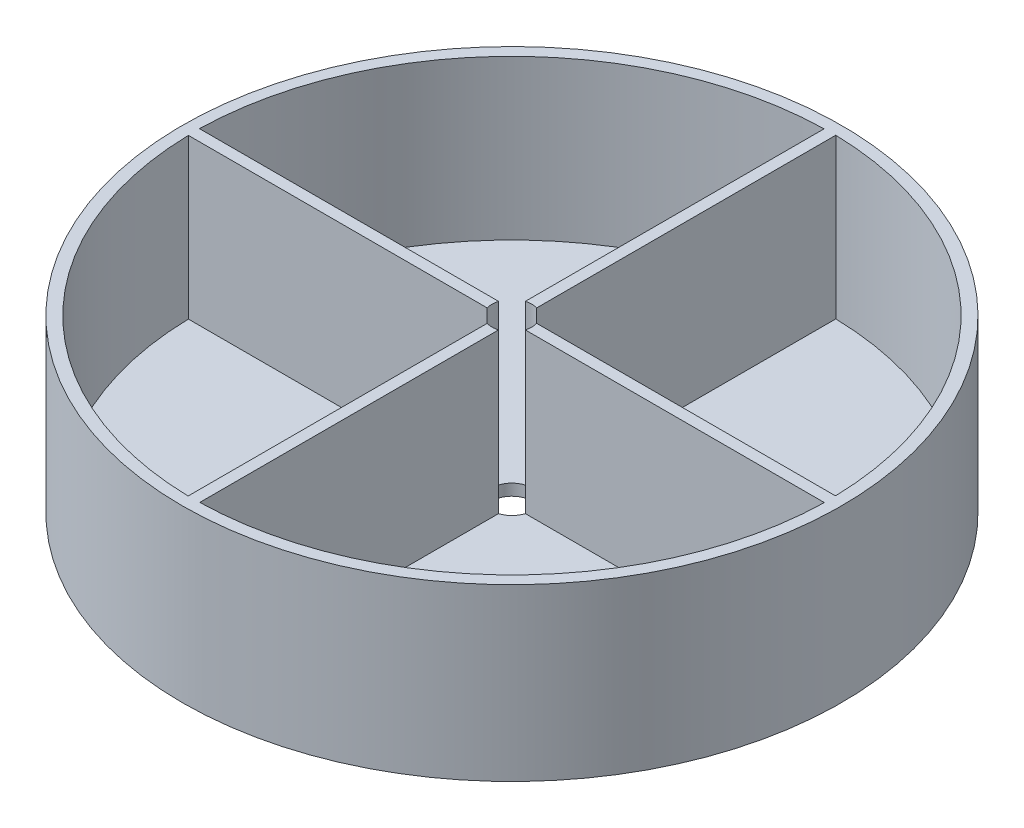
ISO-10303-21;
HEADER;
FILE_DESCRIPTION(('STEP AP214'),'2;1');
FILE_NAME('part.step','',(''),(''),'','','');
FILE_SCHEMA(('AUTOMOTIVE_DESIGN { 1 0 10303 214 1 1 1 1 }'));
ENDSEC;
DATA;
#1=APPLICATION_CONTEXT('core data for automotive mechanical design processes');
#2=APPLICATION_PROTOCOL_DEFINITION('international standard','automotive_design',2000,#1);
#3=PRODUCT_CONTEXT('',#1,'mechanical');
#4=PRODUCT('Part','Part','',(#3));
#5=PRODUCT_RELATED_PRODUCT_CATEGORY('part','',(#4));
#6=PRODUCT_DEFINITION_FORMATION('','',#4);
#7=PRODUCT_DEFINITION_CONTEXT('part definition',#1,'design');
#8=PRODUCT_DEFINITION('design','',#6,#7);
#9=PRODUCT_DEFINITION_SHAPE('','',#8);
#10=(LENGTH_UNIT() NAMED_UNIT(*) SI_UNIT(.MILLI.,.METRE.));
#11=(NAMED_UNIT(*) PLANE_ANGLE_UNIT() SI_UNIT($,.RADIAN.));
#12=(NAMED_UNIT(*) SI_UNIT($,.STERADIAN.) SOLID_ANGLE_UNIT());
#13=UNCERTAINTY_MEASURE_WITH_UNIT(LENGTH_MEASURE(1.E-05),#10,'distance_accuracy_value','');
#14=(GEOMETRIC_REPRESENTATION_CONTEXT(3) GLOBAL_UNCERTAINTY_ASSIGNED_CONTEXT((#13)) GLOBAL_UNIT_ASSIGNED_CONTEXT((#10,
#11,#12)) REPRESENTATION_CONTEXT('',''));
#15=CARTESIAN_POINT('',(0.,0.,0.));
#16=DIRECTION('',(0.,0.,1.));
#17=DIRECTION('',(1.,0.,0.));
#18=AXIS2_PLACEMENT_3D('',#15,#16,#17);
#19=CARTESIAN_POINT('',(0.177726025371028,2.,0.229348354891183));
#20=DIRECTION('',(0.,-1.,0.));
#21=DIRECTION('',(0.,0.,-1.));
#22=AXIS2_PLACEMENT_3D('',#19,#20,#21);
#23=PLANE('',#22);
#24=DIRECTION('',(0.,0.,1.));
#25=VECTOR('',#24,1.);
#26=CARTESIAN_POINT('',(0.999998069287808,2.,-55.9913883981413));
#27=LINE('',#26,#25);
#28=CARTESIAN_POINT('',(0.999998069287808,2.,-55.9913883981413));
#29=VERTEX_POINT('',#28);
#30=CARTESIAN_POINT('',(0.999998069287808,2.,-3.35410254187624));
#31=VERTEX_POINT('',#30);
#32=EDGE_CURVE('E224',#29,#31,#27,.T.);
#33=ORIENTED_EDGE('',*,*,#32,.T.);
#34=CARTESIAN_POINT('',(0.,2.,0.));
#35=DIRECTION('',(0.,1.,0.));
#36=DIRECTION('',(0.,0.,1.));
#37=AXIS2_PLACEMENT_3D('',#34,#35,#36);
#38=CIRCLE('',#37,3.5);
#39=CARTESIAN_POINT('',(3.35409906574127,2.,-1.00000972854944));
#40=VERTEX_POINT('',#39);
#41=EDGE_CURVE('E165',#40,#31,#38,.T.);
#42=ORIENTED_EDGE('',*,*,#41,.F.);
#43=DIRECTION('',(1.,0.,0.));
#44=VECTOR('',#43,1.);
#45=CARTESIAN_POINT('',(0.999998069287808,2.,-1.00000972854944));
#46=LINE('',#45,#44);
#47=CARTESIAN_POINT('',(55.9408605117633,2.,-1.00000972854944));
#48=VERTEX_POINT('',#47);
#49=EDGE_CURVE('E221',#40,#48,#46,.T.);
#50=ORIENTED_EDGE('',*,*,#49,.T.);
#51=CARTESIAN_POINT('',(-0.2293502856028,2.,0.177716296821585));
#52=DIRECTION('',(0.,-1.,0.));
#53=DIRECTION('',(0.,0.,-1.));
#54=AXIS2_PLACEMENT_3D('',#51,#52,#53);
#55=CIRCLE('',#54,56.1825561861631);
#56=EDGE_CURVE('E218',#29,#48,#55,.T.);
#57=ORIENTED_EDGE('',*,*,#56,.F.);
#58=EDGE_LOOP('',(#33,#42,#50,#57));
#59=FACE_BOUND('',#58,.T.);
#60=ADVANCED_FACE('F39',(#59),#23,.F.);
#61=DIRECTION('',(-0.99999999999999,0.,1.44511747345322E-07));
#62=VECTOR('',#61,1.);
#63=CARTESIAN_POINT('',(55.9913615258952,2.,0.9999921655222));
#64=LINE('',#63,#62);
#65=CARTESIAN_POINT('',(55.9913615258952,2.,0.9999921655222));
#66=VERTEX_POINT('',#65);
#67=CARTESIAN_POINT('',(3.3541020341592,2.,0.999999772224545));
#68=VERTEX_POINT('',#67);
#69=EDGE_CURVE('E161',#66,#68,#64,.T.);
#70=ORIENTED_EDGE('',*,*,#69,.T.);
#71=CARTESIAN_POINT('',(0.999997417442707,2.,3.35410273621842));
#72=VERTEX_POINT('',#71);
#73=EDGE_CURVE('E153',#72,#68,#38,.T.);
#74=ORIENTED_EDGE('',*,*,#73,.F.);
#75=DIRECTION('',(-2.76897487340924E-07,0.,0.999999999999962));
#76=VECTOR('',#75,1.);
#77=CARTESIAN_POINT('',(0.999998069287809,2.,1.00000011242022));
#78=LINE('',#77,#76);
#79=CARTESIAN_POINT('',(0.999982856303247,2.,55.9408546079976));
#80=VERTEX_POINT('',#79);
#81=EDGE_CURVE('E158',#72,#80,#78,.T.);
#82=ORIENTED_EDGE('',*,*,#81,.T.);
#83=CARTESIAN_POINT('',(-0.177743169067848,2.,-0.229356189368632));
#84=DIRECTION('',(0.,-1.,0.));
#85=DIRECTION('',(0.,0.,-1.));
#86=AXIS2_PLACEMENT_3D('',#83,#84,#85);
#87=CIRCLE('',#86,56.1825561861632);
#88=EDGE_CURVE('E183',#66,#80,#87,.T.);
#89=ORIENTED_EDGE('',*,*,#88,.F.);
#90=EDGE_LOOP('',(#70,#74,#82,#89));
#91=FACE_BOUND('',#90,.T.);
#92=ADVANCED_FACE('F155',(#91),#23,.F.);
#93=DIRECTION('',(0.,0.,-1.));
#94=VECTOR('',#93,1.);
#95=CARTESIAN_POINT('',(-1.00000080491135,2.,55.9913787820121));
#96=LINE('',#95,#94);
#97=CARTESIAN_POINT('',(-1.00000080491135,2.,55.9913787820121));
#98=VERTEX_POINT('',#97);
#99=CARTESIAN_POINT('',(-1.00000080491135,2.,3.35410172627138));
#100=VERTEX_POINT('',#99);
#101=EDGE_CURVE('E205',#98,#100,#96,.T.);
#102=ORIENTED_EDGE('',*,*,#101,.T.);
#103=CARTESIAN_POINT('',(-3.35410193273245,2.,1.00000011242022));
#104=VERTEX_POINT('',#103);
#105=EDGE_CURVE('E167',#104,#100,#38,.T.);
#106=ORIENTED_EDGE('',*,*,#105,.F.);
#107=DIRECTION('',(-1.,0.,0.));
#108=VECTOR('',#107,1.);
#109=CARTESIAN_POINT('',(-1.00000080491135,2.,1.00000011242022));
#110=LINE('',#109,#108);
#111=CARTESIAN_POINT('',(-55.9408632473865,2.,1.00000011242022));
#112=VERTEX_POINT('',#111);
#113=EDGE_CURVE('E202',#104,#112,#110,.T.);
#114=ORIENTED_EDGE('',*,*,#113,.T.);
#115=CARTESIAN_POINT('',(0.229347549979632,2.,-0.177725912950824));
#116=DIRECTION('',(0.,-1.,0.));
#117=DIRECTION('',(0.,0.,-1.));
#118=AXIS2_PLACEMENT_3D('',#115,#116,#117);
#119=CIRCLE('',#118,56.1825561861632);
#120=EDGE_CURVE('E199',#98,#112,#119,.T.);
#121=ORIENTED_EDGE('',*,*,#120,.F.);
#122=EDGE_LOOP('',(#102,#106,#114,#121));
#123=FACE_BOUND('',#122,.T.);
#124=ADVANCED_FACE('F286',(#123),#23,.F.);
#125=CARTESIAN_POINT('',(-1.00000000000001,2.,-0.999999999999995));
#126=DIRECTION('',(1.,0.,0.));
#127=DIRECTION('',(0.,0.,-1.));
#128=AXIS2_PLACEMENT_3D('',#125,#126,#127);
#129=PLANE('',#128);
#130=DIRECTION('',(0.,-1.,0.));
#131=VECTOR('',#130,1.);
#132=CARTESIAN_POINT('',(-1.00000000000001,30.,-3.35410196624968));
#133=LINE('',#132,#131);
#134=CARTESIAN_POINT('',(-1.00000000000001,30.,-3.35410196624968));
#135=VERTEX_POINT('',#134);
#136=CARTESIAN_POINT('',(-1.00000000000001,2.,-3.35410196624968));
#137=VERTEX_POINT('',#136);
#138=EDGE_CURVE('E193',#135,#137,#133,.T.);
#139=ORIENTED_EDGE('',*,*,#138,.F.);
#140=DIRECTION('',(0.,0.,-1.));
#141=VECTOR('',#140,1.);
#142=CARTESIAN_POINT('',(-1.00000000000001,30.,-0.999999999999995));
#143=LINE('',#142,#141);
#144=CARTESIAN_POINT('',(-1.,30.,-55.9408624424749));
#145=VERTEX_POINT('',#144);
#146=EDGE_CURVE('E252',#135,#145,#143,.T.);
#147=ORIENTED_EDGE('',*,*,#146,.T.);
#148=DIRECTION('',(0.,1.,0.));
#149=VECTOR('',#148,1.);
#150=CARTESIAN_POINT('',(-1.,2.,-55.9408624424749));
#151=LINE('',#150,#149);
#152=CARTESIAN_POINT('',(-1.,2.,-55.9408624424749));
#153=VERTEX_POINT('',#152);
#154=EDGE_CURVE('E258',#153,#145,#151,.T.);
#155=ORIENTED_EDGE('',*,*,#154,.F.);
#156=DIRECTION('',(0.,0.,-1.));
#157=VECTOR('',#156,1.);
#158=CARTESIAN_POINT('',(-1.00000000000001,2.,-0.999999999999995));
#159=LINE('',#158,#157);
#160=EDGE_CURVE('E243',#137,#153,#159,.T.);
#161=ORIENTED_EDGE('',*,*,#160,.F.);
#162=EDGE_LOOP('',(#139,#147,#155,#161));
#163=FACE_BOUND('',#162,.T.);
#164=ADVANCED_FACE('F298',(#163),#129,.F.);
#165=CARTESIAN_POINT('',(-55.9913786695919,2.,-1.));
#166=DIRECTION('',(0.,0.,1.));
#167=DIRECTION('',(1.,0.,0.));
#168=AXIS2_PLACEMENT_3D('',#165,#166,#167);
#169=PLANE('',#168);
#170=DIRECTION('',(0.,-1.,0.));
#171=VECTOR('',#170,1.);
#172=CARTESIAN_POINT('',(-3.35410196624969,30.,-0.999999999999995));
#173=LINE('',#172,#171);
#174=CARTESIAN_POINT('',(-3.35410196624969,2.,-0.999999999999995));
#175=VERTEX_POINT('',#174);
#176=CARTESIAN_POINT('',(-3.35410196624969,30.,-0.999999999999995));
#177=VERTEX_POINT('',#176);
#178=EDGE_CURVE('E323',#175,#177,#173,.F.);
#179=ORIENTED_EDGE('',*,*,#178,.F.);
#180=DIRECTION('',(1.,0.,0.));
#181=VECTOR('',#180,1.);
#182=CARTESIAN_POINT('',(-55.9913786695919,2.,-1.));
#183=LINE('',#182,#181);
#184=CARTESIAN_POINT('',(-55.9913786695919,2.,-1.));
#185=VERTEX_POINT('',#184);
#186=EDGE_CURVE('E246',#185,#175,#183,.T.);
#187=ORIENTED_EDGE('',*,*,#186,.F.);
#188=DIRECTION('',(0.,1.,0.));
#189=VECTOR('',#188,1.);
#190=CARTESIAN_POINT('',(-55.9913786695919,2.,-1.));
#191=LINE('',#190,#189);
#192=CARTESIAN_POINT('',(-55.9913786695919,30.,-1.));
#193=VERTEX_POINT('',#192);
#194=EDGE_CURVE('E249',#185,#193,#191,.T.);
#195=ORIENTED_EDGE('',*,*,#194,.T.);
#196=DIRECTION('',(1.,0.,0.));
#197=VECTOR('',#196,1.);
#198=CARTESIAN_POINT('',(-55.9913786695919,30.,-1.));
#199=LINE('',#198,#197);
#200=EDGE_CURVE('E244',#193,#177,#199,.T.);
#201=ORIENTED_EDGE('',*,*,#200,.T.);
#202=EDGE_LOOP('',(#179,#187,#195,#201));
#203=FACE_BOUND('',#202,.T.);
#204=ADVANCED_FACE('F303',(#203),#169,.F.);
#205=CARTESIAN_POINT('',(0.999998069287808,2.,-1.00000972854944));
#206=DIRECTION('',(0.,0.,1.));
#207=DIRECTION('',(1.,0.,0.));
#208=AXIS2_PLACEMENT_3D('',#205,#206,#207);
#209=PLANE('',#208);
#210=DIRECTION('',(0.,-1.,0.));
#211=VECTOR('',#210,1.);
#212=CARTESIAN_POINT('',(3.35409906574127,30.,-1.00000972854944));
#213=LINE('',#212,#211);
#214=CARTESIAN_POINT('',(3.35409906574127,30.,-1.00000972854944));
#215=VERTEX_POINT('',#214);
#216=EDGE_CURVE('E320',#215,#40,#213,.T.);
#217=ORIENTED_EDGE('',*,*,#216,.F.);
#218=DIRECTION('',(1.,0.,0.));
#219=VECTOR('',#218,1.);
#220=CARTESIAN_POINT('',(0.999998069287808,30.,-1.00000972854944));
#221=LINE('',#220,#219);
#222=CARTESIAN_POINT('',(55.9408605117633,30.,-1.00000972854944));
#223=VERTEX_POINT('',#222);
#224=EDGE_CURVE('E230',#215,#223,#221,.T.);
#225=ORIENTED_EDGE('',*,*,#224,.T.);
#226=DIRECTION('',(0.,1.,0.));
#227=VECTOR('',#226,1.);
#228=CARTESIAN_POINT('',(55.9408605117633,2.,-1.00000972854944));
#229=LINE('',#228,#227);
#230=EDGE_CURVE('E236',#48,#223,#229,.T.);
#231=ORIENTED_EDGE('',*,*,#230,.F.);
#232=ORIENTED_EDGE('',*,*,#49,.F.);
#233=EDGE_LOOP('',(#217,#225,#231,#232));
#234=FACE_BOUND('',#233,.T.);
#235=ADVANCED_FACE('F350',(#234),#209,.F.);
#236=CARTESIAN_POINT('',(0.999998069287808,2.,-55.9913883981413));
#237=DIRECTION('',(-1.,0.,0.));
#238=DIRECTION('',(0.,0.,1.));
#239=AXIS2_PLACEMENT_3D('',#236,#237,#238);
#240=PLANE('',#239);
#241=DIRECTION('',(0.,-1.,0.));
#242=VECTOR('',#241,1.);
#243=CARTESIAN_POINT('',(0.999998069287808,30.,-3.35410254187624));
#244=LINE('',#243,#242);
#245=CARTESIAN_POINT('',(0.999998069287808,30.,-3.35410254187624));
#246=VERTEX_POINT('',#245);
#247=EDGE_CURVE('E315',#31,#246,#244,.F.);
#248=ORIENTED_EDGE('',*,*,#247,.F.);
#249=ORIENTED_EDGE('',*,*,#32,.F.);
#250=DIRECTION('',(0.,1.,0.));
#251=VECTOR('',#250,1.);
#252=CARTESIAN_POINT('',(0.999998069287808,2.,-55.9913883981413));
#253=LINE('',#252,#251);
#254=CARTESIAN_POINT('',(0.999998069287808,30.,-55.9913883981413));
#255=VERTEX_POINT('',#254);
#256=EDGE_CURVE('E227',#29,#255,#253,.T.);
#257=ORIENTED_EDGE('',*,*,#256,.T.);
#258=DIRECTION('',(0.,0.,1.));
#259=VECTOR('',#258,1.);
#260=CARTESIAN_POINT('',(0.999998069287808,30.,-55.9913883981413));
#261=LINE('',#260,#259);
#262=EDGE_CURVE('E222',#255,#246,#261,.T.);
#263=ORIENTED_EDGE('',*,*,#262,.T.);
#264=EDGE_LOOP('',(#248,#249,#257,#263));
#265=FACE_BOUND('',#264,.T.);
#266=ADVANCED_FACE('F357',(#265),#240,.F.);
#267=CARTESIAN_POINT('',(-1.00000080491135,2.,1.00000011242022));
#268=DIRECTION('',(0.,0.,-1.));
#269=DIRECTION('',(-1.,0.,0.));
#270=AXIS2_PLACEMENT_3D('',#267,#268,#269);
#271=PLANE('',#270);
#272=DIRECTION('',(0.,-1.,0.));
#273=VECTOR('',#272,1.);
#274=CARTESIAN_POINT('',(-3.35410193273245,30.,1.00000011242022));
#275=LINE('',#274,#273);
#276=CARTESIAN_POINT('',(-3.35410193273245,30.,1.00000011242022));
#277=VERTEX_POINT('',#276);
#278=EDGE_CURVE('E313',#277,#104,#275,.T.);
#279=ORIENTED_EDGE('',*,*,#278,.F.);
#280=DIRECTION('',(-1.,0.,0.));
#281=VECTOR('',#280,1.);
#282=CARTESIAN_POINT('',(-1.00000080491135,30.,1.00000011242022));
#283=LINE('',#282,#281);
#284=CARTESIAN_POINT('',(-55.9408632473865,30.,1.00000011242022));
#285=VERTEX_POINT('',#284);
#286=EDGE_CURVE('E210',#277,#285,#283,.T.);
#287=ORIENTED_EDGE('',*,*,#286,.T.);
#288=DIRECTION('',(0.,1.,0.));
#289=VECTOR('',#288,1.);
#290=CARTESIAN_POINT('',(-55.9408632473865,2.,1.00000011242022));
#291=LINE('',#290,#289);
#292=EDGE_CURVE('E215',#112,#285,#291,.T.);
#293=ORIENTED_EDGE('',*,*,#292,.F.);
#294=ORIENTED_EDGE('',*,*,#113,.F.);
#295=EDGE_LOOP('',(#279,#287,#293,#294));
#296=FACE_BOUND('',#295,.T.);
#297=ADVANCED_FACE('F361',(#296),#271,.F.);
#298=CARTESIAN_POINT('',(-1.00000080491135,2.,55.9913787820121));
#299=DIRECTION('',(1.,0.,0.));
#300=DIRECTION('',(0.,0.,-1.));
#301=AXIS2_PLACEMENT_3D('',#298,#299,#300);
#302=PLANE('',#301);
#303=DIRECTION('',(0.,-1.,0.));
#304=VECTOR('',#303,1.);
#305=CARTESIAN_POINT('',(-1.00000080491135,30.,3.35410172627138));
#306=LINE('',#305,#304);
#307=CARTESIAN_POINT('',(-1.00000080491135,30.,3.35410172627138));
#308=VERTEX_POINT('',#307);
#309=EDGE_CURVE('E177',#100,#308,#306,.F.);
#310=ORIENTED_EDGE('',*,*,#309,.F.);
#311=ORIENTED_EDGE('',*,*,#101,.F.);
#312=DIRECTION('',(0.,1.,0.));
#313=VECTOR('',#312,1.);
#314=CARTESIAN_POINT('',(-1.00000080491135,2.,55.9913787820121));
#315=LINE('',#314,#313);
#316=CARTESIAN_POINT('',(-1.00000080491135,30.,55.9913787820121));
#317=VERTEX_POINT('',#316);
#318=EDGE_CURVE('E208',#98,#317,#315,.T.);
#319=ORIENTED_EDGE('',*,*,#318,.T.);
#320=DIRECTION('',(0.,0.,-1.));
#321=VECTOR('',#320,1.);
#322=CARTESIAN_POINT('',(-1.00000080491135,30.,55.9913787820121));
#323=LINE('',#322,#321);
#324=EDGE_CURVE('E203',#317,#308,#323,.T.);
#325=ORIENTED_EDGE('',*,*,#324,.T.);
#326=EDGE_LOOP('',(#310,#311,#319,#325));
#327=FACE_BOUND('',#326,.T.);
#328=ADVANCED_FACE('F311',(#327),#302,.F.);
#329=CARTESIAN_POINT('',(0.999998069287809,2.,1.00000011242022));
#330=DIRECTION('',(-0.999999999999962,0.,-2.76897487340924E-07));
#331=DIRECTION('',(-2.76897487340924E-07,0.,0.999999999999962));
#332=AXIS2_PLACEMENT_3D('',#329,#330,#331);
#333=PLANE('',#332);
#334=DIRECTION('',(0.,-1.,0.));
#335=VECTOR('',#334,1.);
#336=CARTESIAN_POINT('',(0.999997417442707,30.,3.35410273621842));
#337=LINE('',#336,#335);
#338=CARTESIAN_POINT('',(0.999997417442707,30.,3.35410273621842));
#339=VERTEX_POINT('',#338);
#340=EDGE_CURVE('E169',#339,#72,#337,.T.);
#341=ORIENTED_EDGE('',*,*,#340,.F.);
#342=DIRECTION('',(-2.76897487340924E-07,0.,0.999999999999962));
#343=VECTOR('',#342,1.);
#344=CARTESIAN_POINT('',(0.999998069287809,30.,1.00000011242022));
#345=LINE('',#344,#343);
#346=CARTESIAN_POINT('',(0.999982856303247,30.,55.9408546079976));
#347=VERTEX_POINT('',#346);
#348=EDGE_CURVE('E192',#339,#347,#345,.T.);
#349=ORIENTED_EDGE('',*,*,#348,.T.);
#350=DIRECTION('',(0.,1.,0.));
#351=VECTOR('',#350,1.);
#352=CARTESIAN_POINT('',(0.999982856303247,2.,55.9408546079976));
#353=LINE('',#352,#351);
#354=EDGE_CURVE('E182',#80,#347,#353,.T.);
#355=ORIENTED_EDGE('',*,*,#354,.F.);
#356=ORIENTED_EDGE('',*,*,#81,.F.);
#357=EDGE_LOOP('',(#341,#349,#355,#356));
#358=FACE_BOUND('',#357,.T.);
#359=ADVANCED_FACE('F181',(#358),#333,.F.);
#360=CARTESIAN_POINT('',(55.9913615258952,2.,0.9999921655222));
#361=DIRECTION('',(-1.44511747345322E-07,0.,-0.99999999999999));
#362=DIRECTION('',(-0.99999999999999,0.,1.44511747345322E-07));
#363=AXIS2_PLACEMENT_3D('',#360,#361,#362);
#364=PLANE('',#363);
#365=DIRECTION('',(0.,-1.,0.));
#366=VECTOR('',#365,1.);
#367=CARTESIAN_POINT('',(3.3541020341592,30.,0.999999772224545));
#368=LINE('',#367,#366);
#369=CARTESIAN_POINT('',(3.3541020341592,30.,0.999999772224545));
#370=VERTEX_POINT('',#369);
#371=EDGE_CURVE('E178',#68,#370,#368,.F.);
#372=ORIENTED_EDGE('',*,*,#371,.F.);
#373=ORIENTED_EDGE('',*,*,#69,.F.);
#374=DIRECTION('',(0.,1.,0.));
#375=VECTOR('',#374,1.);
#376=CARTESIAN_POINT('',(55.9913615258952,2.,0.9999921655222));
#377=LINE('',#376,#375);
#378=CARTESIAN_POINT('',(55.9913615258952,30.,0.9999921655222));
#379=VERTEX_POINT('',#378);
#380=EDGE_CURVE('E185',#66,#379,#377,.T.);
#381=ORIENTED_EDGE('',*,*,#380,.T.);
#382=DIRECTION('',(-0.99999999999999,0.,1.44511747345322E-07));
#383=VECTOR('',#382,1.);
#384=CARTESIAN_POINT('',(55.9913615258952,30.,0.9999921655222));
#385=LINE('',#384,#383);
#386=EDGE_CURVE('E187',#379,#370,#385,.T.);
#387=ORIENTED_EDGE('',*,*,#386,.T.);
#388=EDGE_LOOP('',(#372,#373,#381,#387));
#389=FACE_BOUND('',#388,.T.);
#390=ADVANCED_FACE('F364',(#389),#364,.F.);
#391=CARTESIAN_POINT('',(0.,30.,0.));
#392=DIRECTION('',(0.,1.,0.));
#393=DIRECTION('',(0.,0.,1.));
#394=AXIS2_PLACEMENT_3D('',#391,#392,#393);
#395=PLANE('',#394);
#396=ORIENTED_EDGE('',*,*,#286,.F.);
#397=CARTESIAN_POINT('',(0.,30.,0.));
#398=DIRECTION('',(0.,1.,0.));
#399=DIRECTION('',(0.,0.,1.));
#400=AXIS2_PLACEMENT_3D('',#397,#398,#399);
#401=CIRCLE('',#400,3.5);
#402=EDGE_CURVE('E339',#177,#277,#401,.T.);
#403=ORIENTED_EDGE('',*,*,#402,.F.);
#404=ORIENTED_EDGE('',*,*,#200,.F.);
#405=CARTESIAN_POINT('',(0.177726025371028,30.,0.229348354891183));
#406=DIRECTION('',(0.,-1.,0.));
#407=DIRECTION('',(0.,0.,-1.));
#408=AXIS2_PLACEMENT_3D('',#405,#406,#407);
#409=CIRCLE('',#408,56.1825561861632);
#410=EDGE_CURVE('E239',#193,#145,#409,.T.);
#411=ORIENTED_EDGE('',*,*,#410,.T.);
#412=ORIENTED_EDGE('',*,*,#146,.F.);
#413=EDGE_CURVE('E329',#246,#135,#401,.T.);
#414=ORIENTED_EDGE('',*,*,#413,.F.);
#415=ORIENTED_EDGE('',*,*,#262,.F.);
#416=CARTESIAN_POINT('',(-0.2293502856028,30.,0.177716296821585));
#417=DIRECTION('',(0.,-1.,0.));
#418=DIRECTION('',(0.,0.,-1.));
#419=AXIS2_PLACEMENT_3D('',#416,#417,#418);
#420=CIRCLE('',#419,56.1825561861631);
#421=EDGE_CURVE('E217',#255,#223,#420,.T.);
#422=ORIENTED_EDGE('',*,*,#421,.T.);
#423=ORIENTED_EDGE('',*,*,#224,.F.);
#424=EDGE_CURVE('E342',#370,#215,#401,.T.);
#425=ORIENTED_EDGE('',*,*,#424,.F.);
#426=ORIENTED_EDGE('',*,*,#386,.F.);
#427=CARTESIAN_POINT('',(-0.177743169067848,30.,-0.229356189368632));
#428=DIRECTION('',(0.,-1.,0.));
#429=DIRECTION('',(0.,0.,-1.));
#430=AXIS2_PLACEMENT_3D('',#427,#428,#429);
#431=CIRCLE('',#430,56.1825561861632);
#432=EDGE_CURVE('E54',#379,#347,#431,.T.);
#433=ORIENTED_EDGE('',*,*,#432,.T.);
#434=ORIENTED_EDGE('',*,*,#348,.F.);
#435=EDGE_CURVE('E174',#308,#339,#401,.T.);
#436=ORIENTED_EDGE('',*,*,#435,.F.);
#437=ORIENTED_EDGE('',*,*,#324,.F.);
#438=CARTESIAN_POINT('',(0.229347549979632,30.,-0.177725912950824));
#439=DIRECTION('',(0.,-1.,0.));
#440=DIRECTION('',(0.,0.,-1.));
#441=AXIS2_PLACEMENT_3D('',#438,#439,#440);
#442=CIRCLE('',#441,56.1825561861632);
#443=EDGE_CURVE('E62',#317,#285,#442,.T.);
#444=ORIENTED_EDGE('',*,*,#443,.T.);
#445=EDGE_LOOP('',(#396,#403,#404,#411,#412,#414,#415,#422,#423,#425,#426,#433,#434,#436,#437,#444));
#446=FACE_BOUND('',#445,.T.);
#447=CARTESIAN_POINT('',(0.,30.,0.));
#448=DIRECTION('',(0.,1.,0.));
#449=DIRECTION('',(0.,0.,1.));
#450=AXIS2_PLACEMENT_3D('',#447,#448,#449);
#451=CIRCLE('',#450,58.);
#452=CARTESIAN_POINT('',(0.,30.,58.));
#453=VERTEX_POINT('',#452);
#454=EDGE_CURVE('E11',#453,#453,#451,.T.);
#455=ORIENTED_EDGE('',*,*,#454,.T.);
#456=EDGE_LOOP('',(#455));
#457=FACE_BOUND('',#456,.T.);
#458=ADVANCED_FACE('F276',(#446,#457),#395,.T.);
#459=CARTESIAN_POINT('',(0.,30.,0.));
#460=DIRECTION('',(0.,-1.,0.));
#461=DIRECTION('',(0.,0.,-1.));
#462=AXIS2_PLACEMENT_3D('',#459,#460,#461);
#463=CYLINDRICAL_SURFACE('',#462,58.);
#464=ORIENTED_EDGE('',*,*,#454,.F.);
#465=EDGE_LOOP('',(#464));
#466=FACE_BOUND('',#465,.T.);
#467=CARTESIAN_POINT('',(0.,0.,0.));
#468=DIRECTION('',(0.,1.,0.));
#469=DIRECTION('',(0.,0.,1.));
#470=AXIS2_PLACEMENT_3D('',#467,#468,#469);
#471=CIRCLE('',#470,58.);
#472=CARTESIAN_POINT('',(0.,0.,58.));
#473=VERTEX_POINT('',#472);
#474=EDGE_CURVE('E43',#473,#473,#471,.T.);
#475=ORIENTED_EDGE('',*,*,#474,.T.);
#476=EDGE_LOOP('',(#475));
#477=FACE_BOUND('',#476,.T.);
#478=ADVANCED_FACE('F41',(#466,#477),#463,.T.);
#479=CARTESIAN_POINT('',(0.,0.,0.));
#480=DIRECTION('',(0.,1.,0.));
#481=DIRECTION('',(0.,0.,1.));
#482=AXIS2_PLACEMENT_3D('',#479,#480,#481);
#483=PLANE('',#482);
#484=CARTESIAN_POINT('',(0.,0.,0.));
#485=DIRECTION('',(0.,1.,0.));
#486=DIRECTION('',(0.,0.,1.));
#487=AXIS2_PLACEMENT_3D('',#484,#485,#486);
#488=CIRCLE('',#487,3.5);
#489=CARTESIAN_POINT('',(0.,0.,3.5));
#490=VERTEX_POINT('',#489);
#491=EDGE_CURVE('E164',#490,#490,#488,.T.);
#492=ORIENTED_EDGE('',*,*,#491,.T.);
#493=EDGE_LOOP('',(#492));
#494=FACE_BOUND('',#493,.T.);
#495=ORIENTED_EDGE('',*,*,#474,.F.);
#496=EDGE_LOOP('',(#495));
#497=FACE_BOUND('',#496,.T.);
#498=ADVANCED_FACE('F266',(#494,#497),#483,.F.);
#499=CARTESIAN_POINT('',(0.177726025371028,2.,0.229348354891183));
#500=DIRECTION('',(0.,1.,0.));
#501=DIRECTION('',(0.,0.,1.));
#502=AXIS2_PLACEMENT_3D('',#499,#500,#501);
#503=CYLINDRICAL_SURFACE('',#502,56.1825561861632);
#504=ORIENTED_EDGE('',*,*,#410,.F.);
#505=ORIENTED_EDGE('',*,*,#194,.F.);
#506=CARTESIAN_POINT('',(0.177726025371028,2.,0.229348354891183));
#507=DIRECTION('',(0.,-1.,0.));
#508=DIRECTION('',(0.,0.,-1.));
#509=AXIS2_PLACEMENT_3D('',#506,#507,#508);
#510=CIRCLE('',#509,56.1825561861632);
#511=EDGE_CURVE('E240',#185,#153,#510,.T.);
#512=ORIENTED_EDGE('',*,*,#511,.T.);
#513=ORIENTED_EDGE('',*,*,#154,.T.);
#514=EDGE_LOOP('',(#504,#505,#512,#513));
#515=FACE_BOUND('',#514,.T.);
#516=ADVANCED_FACE('F268',(#515),#503,.F.);
#517=ORIENTED_EDGE('',*,*,#186,.T.);
#518=EDGE_CURVE('E326',#137,#175,#38,.T.);
#519=ORIENTED_EDGE('',*,*,#518,.F.);
#520=ORIENTED_EDGE('',*,*,#160,.T.);
#521=ORIENTED_EDGE('',*,*,#511,.F.);
#522=EDGE_LOOP('',(#517,#519,#520,#521));
#523=FACE_BOUND('',#522,.T.);
#524=ADVANCED_FACE('F274',(#523),#23,.F.);
#525=CARTESIAN_POINT('',(-0.2293502856028,2.,0.177716296821585));
#526=DIRECTION('',(0.,1.,0.));
#527=DIRECTION('',(0.,0.,1.));
#528=AXIS2_PLACEMENT_3D('',#525,#526,#527);
#529=CYLINDRICAL_SURFACE('',#528,56.1825561861631);
#530=ORIENTED_EDGE('',*,*,#421,.F.);
#531=ORIENTED_EDGE('',*,*,#256,.F.);
#532=ORIENTED_EDGE('',*,*,#56,.T.);
#533=ORIENTED_EDGE('',*,*,#230,.T.);
#534=EDGE_LOOP('',(#530,#531,#532,#533));
#535=FACE_BOUND('',#534,.T.);
#536=ADVANCED_FACE('F290',(#535),#529,.F.);
#537=CARTESIAN_POINT('',(0.229347549979632,2.,-0.177725912950824));
#538=DIRECTION('',(0.,1.,0.));
#539=DIRECTION('',(0.,0.,1.));
#540=AXIS2_PLACEMENT_3D('',#537,#538,#539);
#541=CYLINDRICAL_SURFACE('',#540,56.1825561861632);
#542=ORIENTED_EDGE('',*,*,#443,.F.);
#543=ORIENTED_EDGE('',*,*,#318,.F.);
#544=ORIENTED_EDGE('',*,*,#120,.T.);
#545=ORIENTED_EDGE('',*,*,#292,.T.);
#546=EDGE_LOOP('',(#542,#543,#544,#545));
#547=FACE_BOUND('',#546,.T.);
#548=ADVANCED_FACE('F295',(#547),#541,.F.);
#549=CARTESIAN_POINT('',(-0.177743169067848,2.,-0.229356189368632));
#550=DIRECTION('',(0.,1.,0.));
#551=DIRECTION('',(0.,0.,1.));
#552=AXIS2_PLACEMENT_3D('',#549,#550,#551);
#553=CYLINDRICAL_SURFACE('',#552,56.1825561861632);
#554=ORIENTED_EDGE('',*,*,#432,.F.);
#555=ORIENTED_EDGE('',*,*,#380,.F.);
#556=ORIENTED_EDGE('',*,*,#88,.T.);
#557=ORIENTED_EDGE('',*,*,#354,.T.);
#558=EDGE_LOOP('',(#554,#555,#556,#557));
#559=FACE_BOUND('',#558,.T.);
#560=ADVANCED_FACE('F362',(#559),#553,.F.);
#561=CARTESIAN_POINT('',(0.,30.,0.));
#562=DIRECTION('',(0.,-1.,0.));
#563=DIRECTION('',(0.,0.,-1.));
#564=AXIS2_PLACEMENT_3D('',#561,#562,#563);
#565=CYLINDRICAL_SURFACE('',#564,3.5);
#566=ORIENTED_EDGE('',*,*,#138,.T.);
#567=ORIENTED_EDGE('',*,*,#518,.T.);
#568=ORIENTED_EDGE('',*,*,#178,.T.);
#569=ORIENTED_EDGE('',*,*,#402,.T.);
#570=ORIENTED_EDGE('',*,*,#278,.T.);
#571=ORIENTED_EDGE('',*,*,#105,.T.);
#572=ORIENTED_EDGE('',*,*,#309,.T.);
#573=ORIENTED_EDGE('',*,*,#435,.T.);
#574=ORIENTED_EDGE('',*,*,#340,.T.);
#575=ORIENTED_EDGE('',*,*,#73,.T.);
#576=ORIENTED_EDGE('',*,*,#371,.T.);
#577=ORIENTED_EDGE('',*,*,#424,.T.);
#578=ORIENTED_EDGE('',*,*,#216,.T.);
#579=ORIENTED_EDGE('',*,*,#41,.T.);
#580=ORIENTED_EDGE('',*,*,#247,.T.);
#581=ORIENTED_EDGE('',*,*,#413,.T.);
#582=EDGE_LOOP('',(#566,#567,#568,#569,#570,#571,#572,#573,#574,#575,#576,#577,#578,#579,#580,#581));
#583=FACE_BOUND('',#582,.T.);
#584=ORIENTED_EDGE('',*,*,#491,.F.);
#585=EDGE_LOOP('',(#584));
#586=FACE_BOUND('',#585,.T.);
#587=ADVANCED_FACE('F171',(#583,#586),#565,.F.);
#588=CLOSED_SHELL('',(#60,#92,#124,#164,#204,#235,#266,#297,#328,#359,#390,#458,#478,#498,#516,
#524,#536,#548,#560,#587));
#589=MANIFOLD_SOLID_BREP('B2',#588);
#590=ADVANCED_BREP_SHAPE_REPRESENTATION('',(#18,#589),#14);
#591=SHAPE_DEFINITION_REPRESENTATION(#9,#590);
ENDSEC;
END-ISO-10303-21;
